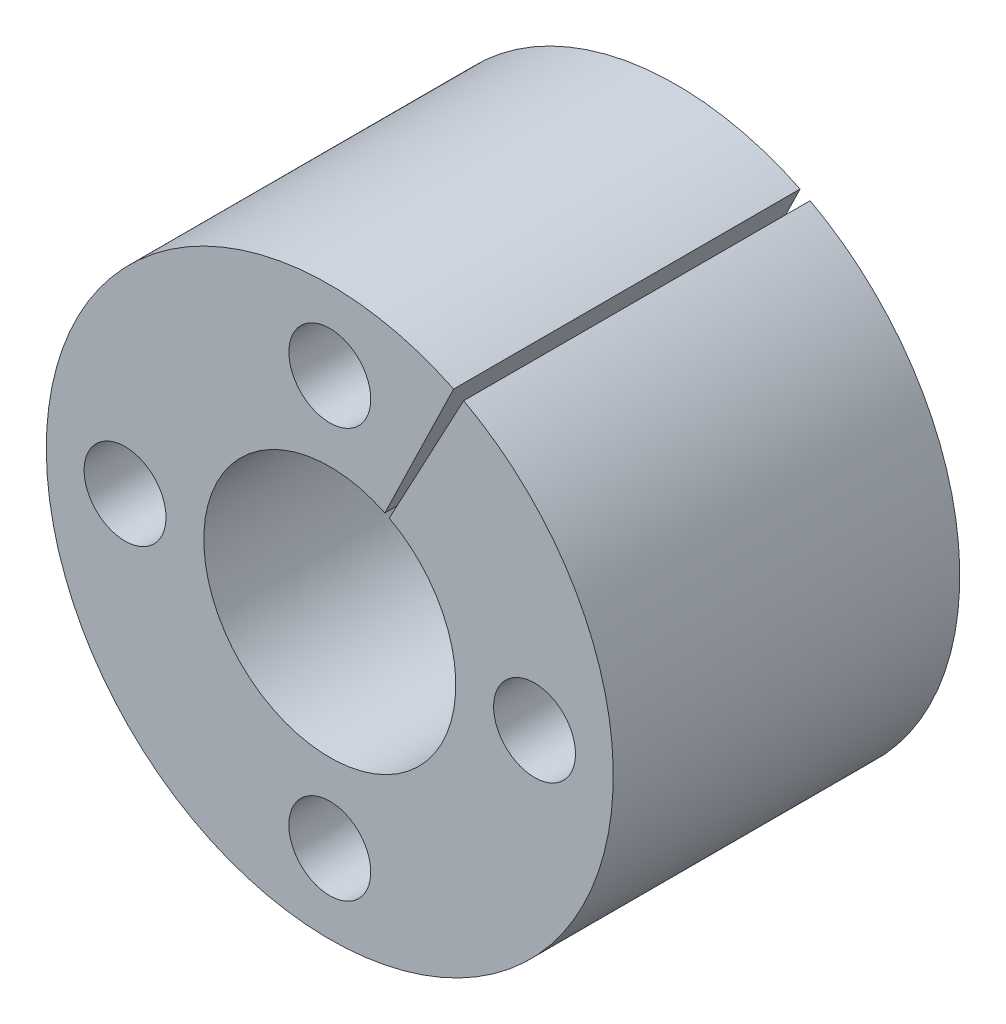
ISO-10303-21;
HEADER;
FILE_DESCRIPTION(('STEP AP214'),'2;1');
FILE_NAME('part.step','',(''),(''),'','','');
FILE_SCHEMA(('AUTOMOTIVE_DESIGN { 1 0 10303 214 1 1 1 1 }'));
ENDSEC;
DATA;
#1=APPLICATION_CONTEXT('core data for automotive mechanical design processes');
#2=APPLICATION_PROTOCOL_DEFINITION('international standard','automotive_design',2000,#1);
#3=PRODUCT_CONTEXT('',#1,'mechanical');
#4=PRODUCT('Part','Part','',(#3));
#5=PRODUCT_RELATED_PRODUCT_CATEGORY('part','',(#4));
#6=PRODUCT_DEFINITION_FORMATION('','',#4);
#7=PRODUCT_DEFINITION_CONTEXT('part definition',#1,'design');
#8=PRODUCT_DEFINITION('design','',#6,#7);
#9=PRODUCT_DEFINITION_SHAPE('','',#8);
#10=(LENGTH_UNIT() NAMED_UNIT(*) SI_UNIT(.MILLI.,.METRE.));
#11=(NAMED_UNIT(*) PLANE_ANGLE_UNIT() SI_UNIT($,.RADIAN.));
#12=(NAMED_UNIT(*) SI_UNIT($,.STERADIAN.) SOLID_ANGLE_UNIT());
#13=UNCERTAINTY_MEASURE_WITH_UNIT(LENGTH_MEASURE(1.E-05),#10,'distance_accuracy_value','');
#14=(GEOMETRIC_REPRESENTATION_CONTEXT(3) GLOBAL_UNCERTAINTY_ASSIGNED_CONTEXT((#13)) GLOBAL_UNIT_ASSIGNED_CONTEXT((#10,
#11,#12)) REPRESENTATION_CONTEXT('',''));
#15=CARTESIAN_POINT('',(0.,0.,0.));
#16=DIRECTION('',(0.,0.,1.));
#17=DIRECTION('',(1.,0.,0.));
#18=AXIS2_PLACEMENT_3D('',#15,#16,#17);
#19=CARTESIAN_POINT('',(0.,0.,11.));
#20=DIRECTION('',(0.,0.,1.));
#21=DIRECTION('',(1.,0.,0.));
#22=AXIS2_PLACEMENT_3D('',#19,#20,#21);
#23=PLANE('',#22);
#24=DIRECTION('',(0.436762182518795,0.899577009444672,0.));
#25=VECTOR('',#24,1.);
#26=CARTESIAN_POINT('',(0.,0.,11.));
#27=LINE('',#26,#25);
#28=CARTESIAN_POINT('',(1.74704873007518,3.59830803777869,11.));
#29=VERTEX_POINT('',#28);
#30=CARTESIAN_POINT('',(3.93085964266915,8.09619308500205,11.));
#31=VERTEX_POINT('',#30);
#32=EDGE_CURVE('E55',#29,#31,#27,.T.);
#33=ORIENTED_EDGE('',*,*,#32,.T.);
#34=CARTESIAN_POINT('',(0.,0.,11.));
#35=DIRECTION('',(0.,0.,1.));
#36=DIRECTION('',(1.,0.,0.));
#37=AXIS2_PLACEMENT_3D('',#34,#35,#36);
#38=CIRCLE('',#37,9.);
#39=CARTESIAN_POINT('',(4.24867640211558,7.934024756081,11.));
#40=VERTEX_POINT('',#39);
#41=EDGE_CURVE('E85',#31,#40,#38,.T.);
#42=ORIENTED_EDGE('',*,*,#41,.T.);
#43=DIRECTION('',(-0.47207515579062,-0.881558306231223,0.));
#44=VECTOR('',#43,1.);
#45=CARTESIAN_POINT('',(4.24867640211558,7.934024756081,11.));
#46=LINE('',#45,#44);
#47=CARTESIAN_POINT('',(1.88830062316248,3.52623322492489,11.));
#48=VERTEX_POINT('',#47);
#49=EDGE_CURVE('E71',#40,#48,#46,.T.);
#50=ORIENTED_EDGE('',*,*,#49,.T.);
#51=CARTESIAN_POINT('',(0.,0.,11.));
#52=DIRECTION('',(0.,0.,1.));
#53=DIRECTION('',(1.,0.,0.));
#54=AXIS2_PLACEMENT_3D('',#51,#52,#53);
#55=CIRCLE('',#54,4.);
#56=EDGE_CURVE('E92',#29,#48,#55,.T.);
#57=ORIENTED_EDGE('',*,*,#56,.F.);
#58=EDGE_LOOP('',(#33,#42,#50,#57));
#59=FACE_BOUND('',#58,.T.);
#60=CARTESIAN_POINT('',(6.5,0.,11.));
#61=DIRECTION('',(0.,0.,1.));
#62=DIRECTION('',(0.,-1.,0.));
#63=AXIS2_PLACEMENT_3D('',#60,#61,#62);
#64=CIRCLE('',#63,1.3);
#65=CARTESIAN_POINT('',(6.5,-1.30000000000002,11.));
#66=VERTEX_POINT('',#65);
#67=EDGE_CURVE('E118',#66,#66,#64,.T.);
#68=ORIENTED_EDGE('',*,*,#67,.F.);
#69=EDGE_LOOP('',(#68));
#70=FACE_BOUND('',#69,.T.);
#71=CARTESIAN_POINT('',(0.,-6.5,11.));
#72=DIRECTION('',(0.,0.,1.));
#73=DIRECTION('',(-1.,0.,0.));
#74=AXIS2_PLACEMENT_3D('',#71,#72,#73);
#75=CIRCLE('',#74,1.3);
#76=CARTESIAN_POINT('',(-1.3,-6.5,11.));
#77=VERTEX_POINT('',#76);
#78=EDGE_CURVE('E112',#77,#77,#75,.T.);
#79=ORIENTED_EDGE('',*,*,#78,.F.);
#80=EDGE_LOOP('',(#79));
#81=FACE_BOUND('',#80,.T.);
#82=CARTESIAN_POINT('',(-6.5,0.,11.));
#83=DIRECTION('',(0.,0.,1.));
#84=DIRECTION('',(0.,1.,0.));
#85=AXIS2_PLACEMENT_3D('',#82,#83,#84);
#86=CIRCLE('',#85,1.3);
#87=CARTESIAN_POINT('',(-6.49999999999999,1.30000000000007,11.));
#88=VERTEX_POINT('',#87);
#89=EDGE_CURVE('E106',#88,#88,#86,.T.);
#90=ORIENTED_EDGE('',*,*,#89,.F.);
#91=EDGE_LOOP('',(#90));
#92=FACE_BOUND('',#91,.T.);
#93=CARTESIAN_POINT('',(0.,6.5,11.));
#94=DIRECTION('',(0.,0.,1.));
#95=DIRECTION('',(1.,0.,0.));
#96=AXIS2_PLACEMENT_3D('',#93,#94,#95);
#97=CIRCLE('',#96,1.3);
#98=CARTESIAN_POINT('',(1.3,6.5,11.));
#99=VERTEX_POINT('',#98);
#100=EDGE_CURVE('E100',#99,#99,#97,.T.);
#101=ORIENTED_EDGE('',*,*,#100,.F.);
#102=EDGE_LOOP('',(#101));
#103=FACE_BOUND('',#102,.T.);
#104=ADVANCED_FACE('F33',(#59,#70,#81,#92,#103),#23,.T.);
#105=CARTESIAN_POINT('',(0.,0.,0.));
#106=DIRECTION('',(0.,0.,1.));
#107=DIRECTION('',(1.,0.,0.));
#108=AXIS2_PLACEMENT_3D('',#105,#106,#107);
#109=PLANE('',#108);
#110=CARTESIAN_POINT('',(6.5,0.,0.));
#111=DIRECTION('',(0.,0.,1.));
#112=DIRECTION('',(0.,-1.,0.));
#113=AXIS2_PLACEMENT_3D('',#110,#111,#112);
#114=CIRCLE('',#113,1.3);
#115=CARTESIAN_POINT('',(6.5,-1.30000000000002,0.));
#116=VERTEX_POINT('',#115);
#117=EDGE_CURVE('E103',#116,#116,#114,.T.);
#118=ORIENTED_EDGE('',*,*,#117,.T.);
#119=EDGE_LOOP('',(#118));
#120=FACE_BOUND('',#119,.T.);
#121=CARTESIAN_POINT('',(0.,-6.5,0.));
#122=DIRECTION('',(0.,0.,1.));
#123=DIRECTION('',(-1.,0.,0.));
#124=AXIS2_PLACEMENT_3D('',#121,#122,#123);
#125=CIRCLE('',#124,1.3);
#126=CARTESIAN_POINT('',(-1.3,-6.5,0.));
#127=VERTEX_POINT('',#126);
#128=EDGE_CURVE('E115',#127,#127,#125,.T.);
#129=ORIENTED_EDGE('',*,*,#128,.T.);
#130=EDGE_LOOP('',(#129));
#131=FACE_BOUND('',#130,.T.);
#132=CARTESIAN_POINT('',(-6.5,0.,0.));
#133=DIRECTION('',(0.,0.,1.));
#134=DIRECTION('',(0.,1.,0.));
#135=AXIS2_PLACEMENT_3D('',#132,#133,#134);
#136=CIRCLE('',#135,1.3);
#137=CARTESIAN_POINT('',(-6.49999999999999,1.30000000000007,0.));
#138=VERTEX_POINT('',#137);
#139=EDGE_CURVE('E109',#138,#138,#136,.T.);
#140=ORIENTED_EDGE('',*,*,#139,.T.);
#141=EDGE_LOOP('',(#140));
#142=FACE_BOUND('',#141,.T.);
#143=CARTESIAN_POINT('',(0.,6.5,0.));
#144=DIRECTION('',(0.,0.,1.));
#145=DIRECTION('',(1.,0.,0.));
#146=AXIS2_PLACEMENT_3D('',#143,#144,#145);
#147=CIRCLE('',#146,1.3);
#148=CARTESIAN_POINT('',(1.3,6.5,0.));
#149=VERTEX_POINT('',#148);
#150=EDGE_CURVE('E98',#149,#149,#147,.T.);
#151=ORIENTED_EDGE('',*,*,#150,.T.);
#152=EDGE_LOOP('',(#151));
#153=FACE_BOUND('',#152,.T.);
#154=CARTESIAN_POINT('',(0.,0.,0.));
#155=DIRECTION('',(0.,0.,1.));
#156=DIRECTION('',(1.,0.,0.));
#157=AXIS2_PLACEMENT_3D('',#154,#155,#156);
#158=CIRCLE('',#157,9.);
#159=CARTESIAN_POINT('',(3.93085964266915,8.09619308500205,0.));
#160=VERTEX_POINT('',#159);
#161=CARTESIAN_POINT('',(4.24867640211558,7.934024756081,0.));
#162=VERTEX_POINT('',#161);
#163=EDGE_CURVE('E87',#160,#162,#158,.T.);
#164=ORIENTED_EDGE('',*,*,#163,.F.);
#165=DIRECTION('',(0.436762182518795,0.899577009444672,0.));
#166=VECTOR('',#165,1.);
#167=CARTESIAN_POINT('',(0.,0.,0.));
#168=LINE('',#167,#166);
#169=CARTESIAN_POINT('',(1.74704873007518,3.59830803777869,0.));
#170=VERTEX_POINT('',#169);
#171=EDGE_CURVE('E79',#170,#160,#168,.T.);
#172=ORIENTED_EDGE('',*,*,#171,.F.);
#173=CARTESIAN_POINT('',(0.,0.,0.));
#174=DIRECTION('',(0.,0.,1.));
#175=DIRECTION('',(1.,0.,0.));
#176=AXIS2_PLACEMENT_3D('',#173,#174,#175);
#177=CIRCLE('',#176,4.);
#178=CARTESIAN_POINT('',(1.88830062316248,3.52623322492489,0.));
#179=VERTEX_POINT('',#178);
#180=EDGE_CURVE('E95',#170,#179,#177,.T.);
#181=ORIENTED_EDGE('',*,*,#180,.T.);
#182=DIRECTION('',(-0.47207515579062,-0.881558306231223,0.));
#183=VECTOR('',#182,1.);
#184=CARTESIAN_POINT('',(4.24867640211558,7.934024756081,0.));
#185=LINE('',#184,#183);
#186=EDGE_CURVE('E48',#162,#179,#185,.T.);
#187=ORIENTED_EDGE('',*,*,#186,.F.);
#188=EDGE_LOOP('',(#164,#172,#181,#187));
#189=FACE_BOUND('',#188,.T.);
#190=ADVANCED_FACE('F130',(#120,#131,#142,#153,#189),#109,.F.);
#191=CARTESIAN_POINT('',(0.,0.,11.));
#192=DIRECTION('',(0.,0.,-1.));
#193=DIRECTION('',(-1.,0.,0.));
#194=AXIS2_PLACEMENT_3D('',#191,#192,#193);
#195=CYLINDRICAL_SURFACE('',#194,9.);
#196=ORIENTED_EDGE('',*,*,#41,.F.);
#197=DIRECTION('',(0.,0.,-1.));
#198=VECTOR('',#197,1.);
#199=CARTESIAN_POINT('',(3.93085964266915,8.09619308500205,11.));
#200=LINE('',#199,#198);
#201=EDGE_CURVE('E88',#31,#160,#200,.T.);
#202=ORIENTED_EDGE('',*,*,#201,.T.);
#203=ORIENTED_EDGE('',*,*,#163,.T.);
#204=DIRECTION('',(0.,0.,-1.));
#205=VECTOR('',#204,1.);
#206=CARTESIAN_POINT('',(4.24867640211558,7.934024756081,11.));
#207=LINE('',#206,#205);
#208=EDGE_CURVE('E74',#40,#162,#207,.T.);
#209=ORIENTED_EDGE('',*,*,#208,.F.);
#210=EDGE_LOOP('',(#196,#202,#203,#209));
#211=FACE_BOUND('',#210,.T.);
#212=ADVANCED_FACE('F35',(#211),#195,.T.);
#213=CARTESIAN_POINT('',(0.,0.,11.));
#214=DIRECTION('',(0.,0.,-1.));
#215=DIRECTION('',(-1.,0.,0.));
#216=AXIS2_PLACEMENT_3D('',#213,#214,#215);
#217=CYLINDRICAL_SURFACE('',#216,4.);
#218=DIRECTION('',(0.,0.,-1.));
#219=VECTOR('',#218,1.);
#220=CARTESIAN_POINT('',(1.74704873007518,3.59830803777869,11.));
#221=LINE('',#220,#219);
#222=EDGE_CURVE('E11',#29,#170,#221,.T.);
#223=ORIENTED_EDGE('',*,*,#222,.F.);
#224=ORIENTED_EDGE('',*,*,#56,.T.);
#225=DIRECTION('',(0.,0.,-1.));
#226=VECTOR('',#225,1.);
#227=CARTESIAN_POINT('',(1.88830062316248,3.52623322492489,11.));
#228=LINE('',#227,#226);
#229=EDGE_CURVE('E41',#179,#48,#228,.F.);
#230=ORIENTED_EDGE('',*,*,#229,.F.);
#231=ORIENTED_EDGE('',*,*,#180,.F.);
#232=EDGE_LOOP('',(#223,#224,#230,#231));
#233=FACE_BOUND('',#232,.T.);
#234=ADVANCED_FACE('F132',(#233),#217,.F.);
#235=CARTESIAN_POINT('',(0.,6.5,0.));
#236=DIRECTION('',(0.,0.,1.));
#237=DIRECTION('',(1.,0.,0.));
#238=AXIS2_PLACEMENT_3D('',#235,#236,#237);
#239=CYLINDRICAL_SURFACE('',#238,1.3);
#240=ORIENTED_EDGE('',*,*,#150,.F.);
#241=EDGE_LOOP('',(#240));
#242=FACE_BOUND('',#241,.T.);
#243=ORIENTED_EDGE('',*,*,#100,.T.);
#244=EDGE_LOOP('',(#243));
#245=FACE_BOUND('',#244,.T.);
#246=ADVANCED_FACE('F134',(#242,#245),#239,.F.);
#247=CARTESIAN_POINT('',(-6.5,0.,0.));
#248=DIRECTION('',(0.,0.,1.));
#249=DIRECTION('',(1.,0.,0.));
#250=AXIS2_PLACEMENT_3D('',#247,#248,#249);
#251=CYLINDRICAL_SURFACE('',#250,1.3);
#252=ORIENTED_EDGE('',*,*,#139,.F.);
#253=EDGE_LOOP('',(#252));
#254=FACE_BOUND('',#253,.T.);
#255=ORIENTED_EDGE('',*,*,#89,.T.);
#256=EDGE_LOOP('',(#255));
#257=FACE_BOUND('',#256,.T.);
#258=ADVANCED_FACE('F140',(#254,#257),#251,.F.);
#259=CARTESIAN_POINT('',(0.,-6.5,0.));
#260=DIRECTION('',(0.,0.,1.));
#261=DIRECTION('',(1.,0.,0.));
#262=AXIS2_PLACEMENT_3D('',#259,#260,#261);
#263=CYLINDRICAL_SURFACE('',#262,1.3);
#264=ORIENTED_EDGE('',*,*,#128,.F.);
#265=EDGE_LOOP('',(#264));
#266=FACE_BOUND('',#265,.T.);
#267=ORIENTED_EDGE('',*,*,#78,.T.);
#268=EDGE_LOOP('',(#267));
#269=FACE_BOUND('',#268,.T.);
#270=ADVANCED_FACE('F164',(#266,#269),#263,.F.);
#271=CARTESIAN_POINT('',(6.5,0.,0.));
#272=DIRECTION('',(0.,0.,1.));
#273=DIRECTION('',(1.,0.,0.));
#274=AXIS2_PLACEMENT_3D('',#271,#272,#273);
#275=CYLINDRICAL_SURFACE('',#274,1.3);
#276=ORIENTED_EDGE('',*,*,#117,.F.);
#277=EDGE_LOOP('',(#276));
#278=FACE_BOUND('',#277,.T.);
#279=ORIENTED_EDGE('',*,*,#67,.T.);
#280=EDGE_LOOP('',(#279));
#281=FACE_BOUND('',#280,.T.);
#282=ADVANCED_FACE('F171',(#278,#281),#275,.F.);
#283=CARTESIAN_POINT('',(4.24867640211558,7.934024756081,11.));
#284=DIRECTION('',(0.881558306231223,-0.47207515579062,0.));
#285=DIRECTION('',(0.47207515579062,0.881558306231223,0.));
#286=AXIS2_PLACEMENT_3D('',#283,#284,#285);
#287=PLANE('',#286);
#288=ORIENTED_EDGE('',*,*,#229,.T.);
#289=ORIENTED_EDGE('',*,*,#49,.F.);
#290=ORIENTED_EDGE('',*,*,#208,.T.);
#291=ORIENTED_EDGE('',*,*,#186,.T.);
#292=EDGE_LOOP('',(#288,#289,#290,#291));
#293=FACE_BOUND('',#292,.T.);
#294=ADVANCED_FACE('F73',(#293),#287,.F.);
#295=CARTESIAN_POINT('',(0.,0.,11.));
#296=DIRECTION('',(-0.899577009444672,0.436762182518795,0.));
#297=DIRECTION('',(-0.436762182518795,-0.899577009444672,0.));
#298=AXIS2_PLACEMENT_3D('',#295,#296,#297);
#299=PLANE('',#298);
#300=ORIENTED_EDGE('',*,*,#222,.T.);
#301=ORIENTED_EDGE('',*,*,#171,.T.);
#302=ORIENTED_EDGE('',*,*,#201,.F.);
#303=ORIENTED_EDGE('',*,*,#32,.F.);
#304=EDGE_LOOP('',(#300,#301,#302,#303));
#305=FACE_BOUND('',#304,.T.);
#306=ADVANCED_FACE('F127',(#305),#299,.F.);
#307=CLOSED_SHELL('',(#104,#190,#212,#234,#246,#258,#270,#282,#294,#306));
#308=MANIFOLD_SOLID_BREP('B2',#307);
#309=ADVANCED_BREP_SHAPE_REPRESENTATION('',(#18,#308),#14);
#310=SHAPE_DEFINITION_REPRESENTATION(#9,#309);
ENDSEC;
END-ISO-10303-21;
